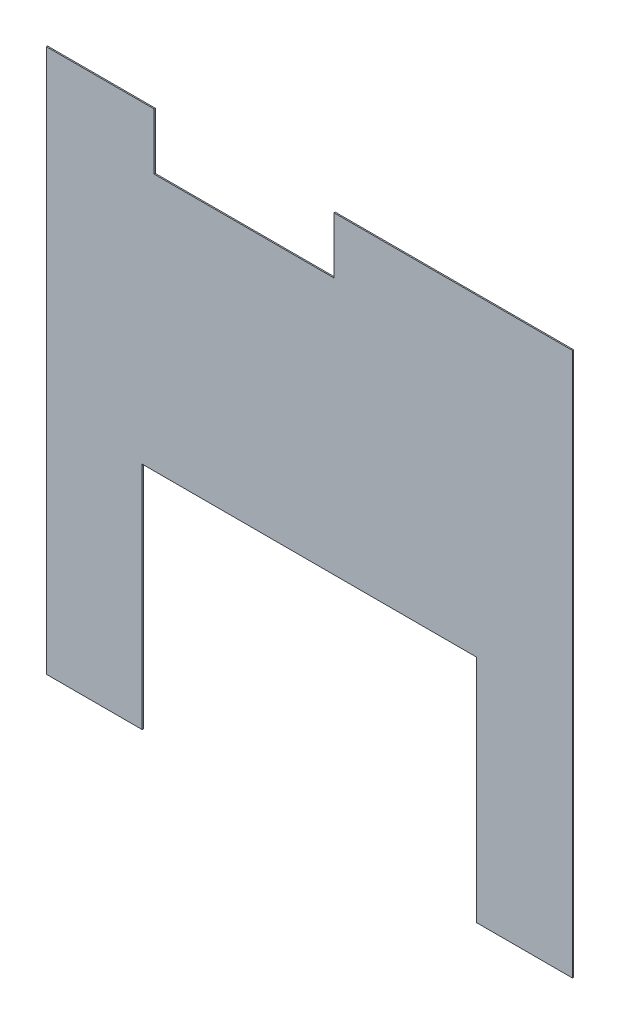
ISO-10303-21;
HEADER;
FILE_DESCRIPTION(('STEP AP214'),'2;1');
FILE_NAME('part.step','',(''),(''),'','','');
FILE_SCHEMA(('AUTOMOTIVE_DESIGN { 1 0 10303 214 1 1 1 1 }'));
ENDSEC;
DATA;
#1=APPLICATION_CONTEXT('core data for automotive mechanical design processes');
#2=APPLICATION_PROTOCOL_DEFINITION('international standard','automotive_design',2000,#1);
#3=PRODUCT_CONTEXT('',#1,'mechanical');
#4=PRODUCT('Part','Part','',(#3));
#5=PRODUCT_RELATED_PRODUCT_CATEGORY('part','',(#4));
#6=PRODUCT_DEFINITION_FORMATION('','',#4);
#7=PRODUCT_DEFINITION_CONTEXT('part definition',#1,'design');
#8=PRODUCT_DEFINITION('design','',#6,#7);
#9=PRODUCT_DEFINITION_SHAPE('','',#8);
#10=(LENGTH_UNIT() NAMED_UNIT(*) SI_UNIT(.MILLI.,.METRE.));
#11=(NAMED_UNIT(*) PLANE_ANGLE_UNIT() SI_UNIT($,.RADIAN.));
#12=(NAMED_UNIT(*) SI_UNIT($,.STERADIAN.) SOLID_ANGLE_UNIT());
#13=UNCERTAINTY_MEASURE_WITH_UNIT(LENGTH_MEASURE(1.E-05),#10,'distance_accuracy_value','');
#14=(GEOMETRIC_REPRESENTATION_CONTEXT(3) GLOBAL_UNCERTAINTY_ASSIGNED_CONTEXT((#13)) GLOBAL_UNIT_ASSIGNED_CONTEXT((#10,
#11,#12)) REPRESENTATION_CONTEXT('',''));
#15=CARTESIAN_POINT('',(0.,0.,0.));
#16=DIRECTION('',(0.,0.,1.));
#17=DIRECTION('',(1.,0.,0.));
#18=AXIS2_PLACEMENT_3D('',#15,#16,#17);
#19=CARTESIAN_POINT('',(0.,0.,2.9));
#20=DIRECTION('',(0.,-1.,0.));
#21=DIRECTION('',(0.,0.,-1.));
#22=AXIS2_PLACEMENT_3D('',#19,#20,#21);
#23=PLANE('',#22);
#24=DIRECTION('',(-1.,0.,0.));
#25=VECTOR('',#24,1.);
#26=CARTESIAN_POINT('',(0.,0.,2.9));
#27=LINE('',#26,#25);
#28=CARTESIAN_POINT('',(258.,0.,2.9));
#29=VERTEX_POINT('',#28);
#30=CARTESIAN_POINT('',(0.,0.,2.9));
#31=VERTEX_POINT('',#30);
#32=EDGE_CURVE('E186',#29,#31,#27,.T.);
#33=ORIENTED_EDGE('',*,*,#32,.F.);
#34=DIRECTION('',(0.,0.,1.));
#35=VECTOR('',#34,1.);
#36=CARTESIAN_POINT('',(258.,0.,-7.1));
#37=LINE('',#36,#35);
#38=CARTESIAN_POINT('',(258.,0.,0.));
#39=VERTEX_POINT('',#38);
#40=EDGE_CURVE('E137',#39,#29,#37,.T.);
#41=ORIENTED_EDGE('',*,*,#40,.F.);
#42=DIRECTION('',(-1.,0.,0.));
#43=VECTOR('',#42,1.);
#44=CARTESIAN_POINT('',(0.,0.,0.));
#45=LINE('',#44,#43);
#46=CARTESIAN_POINT('',(0.,0.,0.));
#47=VERTEX_POINT('',#46);
#48=EDGE_CURVE('E198',#39,#47,#45,.T.);
#49=ORIENTED_EDGE('',*,*,#48,.T.);
#50=DIRECTION('',(0.,0.,-1.));
#51=VECTOR('',#50,1.);
#52=CARTESIAN_POINT('',(0.,0.,2.9));
#53=LINE('',#52,#51);
#54=EDGE_CURVE('E189',#31,#47,#53,.T.);
#55=ORIENTED_EDGE('',*,*,#54,.F.);
#56=EDGE_LOOP('',(#33,#41,#49,#55));
#57=FACE_BOUND('',#56,.T.);
#58=ADVANCED_FACE('F35',(#57),#23,.F.);
#59=CARTESIAN_POINT('',(1.59204083889156E-13,-1300.,2.9));
#60=DIRECTION('',(0.,1.,0.));
#61=DIRECTION('',(0.,0.,1.));
#62=AXIS2_PLACEMENT_3D('',#59,#60,#61);
#63=PLANE('',#62);
#64=DIRECTION('',(1.,0.,0.));
#65=VECTOR('',#64,1.);
#66=CARTESIAN_POINT('',(1.59204083889156E-13,-1300.,0.));
#67=LINE('',#66,#65);
#68=CARTESIAN_POINT('',(1.59204083889156E-13,-1300.,0.));
#69=VERTEX_POINT('',#68);
#70=CARTESIAN_POINT('',(229.1,-1300.,0.));
#71=VERTEX_POINT('',#70);
#72=EDGE_CURVE('E193',#69,#71,#67,.T.);
#73=ORIENTED_EDGE('',*,*,#72,.T.);
#74=DIRECTION('',(0.,0.,1.));
#75=VECTOR('',#74,1.);
#76=CARTESIAN_POINT('',(229.1,-1300.,0.));
#77=LINE('',#76,#75);
#78=CARTESIAN_POINT('',(229.1,-1300.,2.9));
#79=VERTEX_POINT('',#78);
#80=EDGE_CURVE('E167',#71,#79,#77,.T.);
#81=ORIENTED_EDGE('',*,*,#80,.T.);
#82=DIRECTION('',(1.,0.,0.));
#83=VECTOR('',#82,1.);
#84=CARTESIAN_POINT('',(1.59204083889156E-13,-1300.,2.9));
#85=LINE('',#84,#83);
#86=CARTESIAN_POINT('',(1.59204083889156E-13,-1300.,2.9));
#87=VERTEX_POINT('',#86);
#88=EDGE_CURVE('E181',#87,#79,#85,.T.);
#89=ORIENTED_EDGE('',*,*,#88,.F.);
#90=DIRECTION('',(0.,0.,-1.));
#91=VECTOR('',#90,1.);
#92=CARTESIAN_POINT('',(1.59204083889156E-13,-1300.,2.9));
#93=LINE('',#92,#91);
#94=EDGE_CURVE('E209',#87,#69,#93,.T.);
#95=ORIENTED_EDGE('',*,*,#94,.T.);
#96=EDGE_LOOP('',(#73,#81,#89,#95));
#97=FACE_BOUND('',#96,.T.);
#98=ADVANCED_FACE('F243',(#97),#63,.F.);
#99=CARTESIAN_POINT('',(0.,0.,2.9));
#100=DIRECTION('',(1.,0.,0.));
#101=DIRECTION('',(0.,1.,0.));
#102=AXIS2_PLACEMENT_3D('',#99,#100,#101);
#103=PLANE('',#102);
#104=DIRECTION('',(0.,-1.,0.));
#105=VECTOR('',#104,1.);
#106=CARTESIAN_POINT('',(0.,0.,0.));
#107=LINE('',#106,#105);
#108=EDGE_CURVE('E170',#47,#69,#107,.T.);
#109=ORIENTED_EDGE('',*,*,#108,.T.);
#110=ORIENTED_EDGE('',*,*,#94,.F.);
#111=DIRECTION('',(0.,-1.,0.));
#112=VECTOR('',#111,1.);
#113=CARTESIAN_POINT('',(0.,0.,2.9));
#114=LINE('',#113,#112);
#115=EDGE_CURVE('E176',#31,#87,#114,.T.);
#116=ORIENTED_EDGE('',*,*,#115,.F.);
#117=ORIENTED_EDGE('',*,*,#54,.T.);
#118=EDGE_LOOP('',(#109,#110,#116,#117));
#119=FACE_BOUND('',#118,.T.);
#120=ADVANCED_FACE('F37',(#119),#103,.F.);
#121=CARTESIAN_POINT('',(1029.1,-1300.,2.9));
#122=VERTEX_POINT('',#121);
#123=CARTESIAN_POINT('',(1258.2,-1300.,2.9));
#124=VERTEX_POINT('',#123);
#125=EDGE_CURVE('E179',#122,#124,#85,.T.);
#126=ORIENTED_EDGE('',*,*,#125,.F.);
#127=DIRECTION('',(0.,0.,1.));
#128=VECTOR('',#127,1.);
#129=CARTESIAN_POINT('',(1029.1,-1300.,0.));
#130=LINE('',#129,#128);
#131=CARTESIAN_POINT('',(1029.1,-1300.,0.));
#132=VERTEX_POINT('',#131);
#133=EDGE_CURVE('E160',#132,#122,#130,.T.);
#134=ORIENTED_EDGE('',*,*,#133,.F.);
#135=CARTESIAN_POINT('',(1258.2,-1300.,0.));
#136=VERTEX_POINT('',#135);
#137=EDGE_CURVE('E192',#132,#136,#67,.T.);
#138=ORIENTED_EDGE('',*,*,#137,.T.);
#139=DIRECTION('',(0.,0.,-1.));
#140=VECTOR('',#139,1.);
#141=CARTESIAN_POINT('',(1258.2,-1300.,2.9));
#142=LINE('',#141,#140);
#143=EDGE_CURVE('E206',#124,#136,#142,.T.);
#144=ORIENTED_EDGE('',*,*,#143,.F.);
#145=EDGE_LOOP('',(#126,#134,#138,#144));
#146=FACE_BOUND('',#145,.T.);
#147=ADVANCED_FACE('F231',(#146),#63,.F.);
#148=CARTESIAN_POINT('',(1258.2,0.,2.9));
#149=DIRECTION('',(-1.,0.,0.));
#150=DIRECTION('',(0.,-1.,0.));
#151=AXIS2_PLACEMENT_3D('',#148,#149,#150);
#152=PLANE('',#151);
#153=DIRECTION('',(0.,1.,0.));
#154=VECTOR('',#153,1.);
#155=CARTESIAN_POINT('',(1258.2,0.,0.));
#156=LINE('',#155,#154);
#157=CARTESIAN_POINT('',(1258.2,0.,0.));
#158=VERTEX_POINT('',#157);
#159=EDGE_CURVE('E196',#136,#158,#156,.T.);
#160=ORIENTED_EDGE('',*,*,#159,.T.);
#161=DIRECTION('',(0.,0.,-1.));
#162=VECTOR('',#161,1.);
#163=CARTESIAN_POINT('',(1258.2,0.,2.9));
#164=LINE('',#163,#162);
#165=CARTESIAN_POINT('',(1258.2,0.,2.9));
#166=VERTEX_POINT('',#165);
#167=EDGE_CURVE('E203',#166,#158,#164,.T.);
#168=ORIENTED_EDGE('',*,*,#167,.F.);
#169=DIRECTION('',(0.,1.,0.));
#170=VECTOR('',#169,1.);
#171=CARTESIAN_POINT('',(1258.2,0.,2.9));
#172=LINE('',#171,#170);
#173=EDGE_CURVE('E184',#124,#166,#172,.T.);
#174=ORIENTED_EDGE('',*,*,#173,.F.);
#175=ORIENTED_EDGE('',*,*,#143,.T.);
#176=EDGE_LOOP('',(#160,#168,#174,#175));
#177=FACE_BOUND('',#176,.T.);
#178=ADVANCED_FACE('F225',(#177),#152,.F.);
#179=CARTESIAN_POINT('',(688.,0.,0.));
#180=VERTEX_POINT('',#179);
#181=EDGE_CURVE('E180',#158,#180,#45,.T.);
#182=ORIENTED_EDGE('',*,*,#181,.T.);
#183=DIRECTION('',(0.,0.,1.));
#184=VECTOR('',#183,1.);
#185=CARTESIAN_POINT('',(688.,0.,-7.1));
#186=LINE('',#185,#184);
#187=CARTESIAN_POINT('',(688.,0.,2.9));
#188=VERTEX_POINT('',#187);
#189=EDGE_CURVE('E148',#180,#188,#186,.T.);
#190=ORIENTED_EDGE('',*,*,#189,.T.);
#191=EDGE_CURVE('E187',#166,#188,#27,.T.);
#192=ORIENTED_EDGE('',*,*,#191,.F.);
#193=ORIENTED_EDGE('',*,*,#167,.T.);
#194=EDGE_LOOP('',(#182,#190,#192,#193));
#195=FACE_BOUND('',#194,.T.);
#196=ADVANCED_FACE('F220',(#195),#23,.F.);
#197=CARTESIAN_POINT('',(0.,0.,2.9));
#198=DIRECTION('',(0.,0.,1.));
#199=DIRECTION('',(1.,0.,0.));
#200=AXIS2_PLACEMENT_3D('',#197,#198,#199);
#201=PLANE('',#200);
#202=DIRECTION('',(0.,-1.,0.));
#203=VECTOR('',#202,1.);
#204=CARTESIAN_POINT('',(258.,0.,2.9));
#205=LINE('',#204,#203);
#206=CARTESIAN_POINT('',(258.,-134.999999999999,2.9));
#207=VERTEX_POINT('',#206);
#208=EDGE_CURVE('E134',#29,#207,#205,.T.);
#209=ORIENTED_EDGE('',*,*,#208,.F.);
#210=ORIENTED_EDGE('',*,*,#32,.T.);
#211=ORIENTED_EDGE('',*,*,#115,.T.);
#212=ORIENTED_EDGE('',*,*,#88,.T.);
#213=DIRECTION('',(0.,-1.,0.));
#214=VECTOR('',#213,1.);
#215=CARTESIAN_POINT('',(229.1,-1300.,2.9));
#216=LINE('',#215,#214);
#217=CARTESIAN_POINT('',(229.1,-750.,2.9));
#218=VERTEX_POINT('',#217);
#219=EDGE_CURVE('E155',#218,#79,#216,.T.);
#220=ORIENTED_EDGE('',*,*,#219,.F.);
#221=DIRECTION('',(-1.,0.,0.));
#222=VECTOR('',#221,1.);
#223=CARTESIAN_POINT('',(229.1,-750.,2.9));
#224=LINE('',#223,#222);
#225=CARTESIAN_POINT('',(1029.1,-750.,2.9));
#226=VERTEX_POINT('',#225);
#227=EDGE_CURVE('E163',#226,#218,#224,.T.);
#228=ORIENTED_EDGE('',*,*,#227,.F.);
#229=DIRECTION('',(0.,1.,0.));
#230=VECTOR('',#229,1.);
#231=CARTESIAN_POINT('',(1029.1,-1300.,2.9));
#232=LINE('',#231,#230);
#233=EDGE_CURVE('E147',#122,#226,#232,.T.);
#234=ORIENTED_EDGE('',*,*,#233,.F.);
#235=ORIENTED_EDGE('',*,*,#125,.T.);
#236=ORIENTED_EDGE('',*,*,#173,.T.);
#237=ORIENTED_EDGE('',*,*,#191,.T.);
#238=DIRECTION('',(0.,1.,0.));
#239=VECTOR('',#238,1.);
#240=CARTESIAN_POINT('',(688.,0.,2.9));
#241=LINE('',#240,#239);
#242=CARTESIAN_POINT('',(688.,-135.,2.9));
#243=VERTEX_POINT('',#242);
#244=EDGE_CURVE('E131',#243,#188,#241,.T.);
#245=ORIENTED_EDGE('',*,*,#244,.F.);
#246=DIRECTION('',(1.,0.,0.));
#247=VECTOR('',#246,1.);
#248=CARTESIAN_POINT('',(258.,-134.999999999999,2.9));
#249=LINE('',#248,#247);
#250=EDGE_CURVE('E126',#207,#243,#249,.T.);
#251=ORIENTED_EDGE('',*,*,#250,.F.);
#252=EDGE_LOOP('',(#209,#210,#211,#212,#220,#228,#234,#235,#236,#237,#245,#251));
#253=FACE_BOUND('',#252,.T.);
#254=ADVANCED_FACE('F141',(#253),#201,.T.);
#255=CARTESIAN_POINT('',(0.,0.,0.));
#256=DIRECTION('',(0.,0.,1.));
#257=DIRECTION('',(1.,0.,0.));
#258=AXIS2_PLACEMENT_3D('',#255,#256,#257);
#259=PLANE('',#258);
#260=ORIENTED_EDGE('',*,*,#48,.F.);
#261=DIRECTION('',(0.,-1.,0.));
#262=VECTOR('',#261,1.);
#263=CARTESIAN_POINT('',(258.,2.12175955817253E-13,0.));
#264=LINE('',#263,#262);
#265=CARTESIAN_POINT('',(258.,-134.999999999999,0.));
#266=VERTEX_POINT('',#265);
#267=EDGE_CURVE('E11',#39,#266,#264,.T.);
#268=ORIENTED_EDGE('',*,*,#267,.T.);
#269=DIRECTION('',(1.,0.,0.));
#270=VECTOR('',#269,1.);
#271=CARTESIAN_POINT('',(0.,-134.999999999999,0.));
#272=LINE('',#271,#270);
#273=CARTESIAN_POINT('',(688.,-135.,0.));
#274=VERTEX_POINT('',#273);
#275=EDGE_CURVE('E129',#266,#274,#272,.T.);
#276=ORIENTED_EDGE('',*,*,#275,.T.);
#277=DIRECTION('',(0.,1.,0.));
#278=VECTOR('',#277,1.);
#279=CARTESIAN_POINT('',(688.,5.65802548846007E-13,0.));
#280=LINE('',#279,#278);
#281=EDGE_CURVE('E43',#274,#180,#280,.T.);
#282=ORIENTED_EDGE('',*,*,#281,.T.);
#283=ORIENTED_EDGE('',*,*,#181,.F.);
#284=ORIENTED_EDGE('',*,*,#159,.F.);
#285=ORIENTED_EDGE('',*,*,#137,.F.);
#286=DIRECTION('',(0.,1.,0.));
#287=VECTOR('',#286,1.);
#288=CARTESIAN_POINT('',(1029.1,-1300.,0.));
#289=LINE('',#288,#287);
#290=CARTESIAN_POINT('',(1029.1,-750.,0.));
#291=VERTEX_POINT('',#290);
#292=EDGE_CURVE('E152',#132,#291,#289,.T.);
#293=ORIENTED_EDGE('',*,*,#292,.T.);
#294=DIRECTION('',(-1.,0.,0.));
#295=VECTOR('',#294,1.);
#296=CARTESIAN_POINT('',(229.1,-750.,0.));
#297=LINE('',#296,#295);
#298=CARTESIAN_POINT('',(229.1,-750.,0.));
#299=VERTEX_POINT('',#298);
#300=EDGE_CURVE('E58',#291,#299,#297,.T.);
#301=ORIENTED_EDGE('',*,*,#300,.T.);
#302=DIRECTION('',(0.,-1.,0.));
#303=VECTOR('',#302,1.);
#304=CARTESIAN_POINT('',(229.1,-1300.,0.));
#305=LINE('',#304,#303);
#306=EDGE_CURVE('E157',#299,#71,#305,.T.);
#307=ORIENTED_EDGE('',*,*,#306,.T.);
#308=ORIENTED_EDGE('',*,*,#72,.F.);
#309=ORIENTED_EDGE('',*,*,#108,.F.);
#310=EDGE_LOOP('',(#260,#268,#276,#282,#283,#284,#285,#293,#301,#307,#308,#309));
#311=FACE_BOUND('',#310,.T.);
#312=ADVANCED_FACE('F216',(#311),#259,.F.);
#313=CARTESIAN_POINT('',(229.1,-1300.,0.));
#314=DIRECTION('',(-1.,0.,0.));
#315=DIRECTION('',(0.,0.,1.));
#316=AXIS2_PLACEMENT_3D('',#313,#314,#315);
#317=PLANE('',#316);
#318=ORIENTED_EDGE('',*,*,#219,.T.);
#319=ORIENTED_EDGE('',*,*,#80,.F.);
#320=ORIENTED_EDGE('',*,*,#306,.F.);
#321=DIRECTION('',(0.,0.,1.));
#322=VECTOR('',#321,1.);
#323=CARTESIAN_POINT('',(229.1,-750.,0.));
#324=LINE('',#323,#322);
#325=EDGE_CURVE('E171',#299,#218,#324,.T.);
#326=ORIENTED_EDGE('',*,*,#325,.T.);
#327=EDGE_LOOP('',(#318,#319,#320,#326));
#328=FACE_BOUND('',#327,.T.);
#329=ADVANCED_FACE('F240',(#328),#317,.F.);
#330=CARTESIAN_POINT('',(229.1,-750.,0.));
#331=DIRECTION('',(0.,1.,0.));
#332=DIRECTION('',(0.,0.,1.));
#333=AXIS2_PLACEMENT_3D('',#330,#331,#332);
#334=PLANE('',#333);
#335=ORIENTED_EDGE('',*,*,#227,.T.);
#336=ORIENTED_EDGE('',*,*,#325,.F.);
#337=ORIENTED_EDGE('',*,*,#300,.F.);
#338=DIRECTION('',(0.,0.,1.));
#339=VECTOR('',#338,1.);
#340=CARTESIAN_POINT('',(1029.1,-750.,0.));
#341=LINE('',#340,#339);
#342=EDGE_CURVE('E173',#291,#226,#341,.T.);
#343=ORIENTED_EDGE('',*,*,#342,.T.);
#344=EDGE_LOOP('',(#335,#336,#337,#343));
#345=FACE_BOUND('',#344,.T.);
#346=ADVANCED_FACE('F237',(#345),#334,.F.);
#347=CARTESIAN_POINT('',(1029.1,-1300.,0.));
#348=DIRECTION('',(1.,0.,0.));
#349=DIRECTION('',(0.,0.,-1.));
#350=AXIS2_PLACEMENT_3D('',#347,#348,#349);
#351=PLANE('',#350);
#352=ORIENTED_EDGE('',*,*,#233,.T.);
#353=ORIENTED_EDGE('',*,*,#342,.F.);
#354=ORIENTED_EDGE('',*,*,#292,.F.);
#355=ORIENTED_EDGE('',*,*,#133,.T.);
#356=EDGE_LOOP('',(#352,#353,#354,#355));
#357=FACE_BOUND('',#356,.T.);
#358=ADVANCED_FACE('F234',(#357),#351,.F.);
#359=CARTESIAN_POINT('',(258.,0.,-7.1));
#360=DIRECTION('',(-1.,0.,0.));
#361=DIRECTION('',(0.,-1.,0.));
#362=AXIS2_PLACEMENT_3D('',#359,#360,#361);
#363=PLANE('',#362);
#364=ORIENTED_EDGE('',*,*,#40,.T.);
#365=ORIENTED_EDGE('',*,*,#208,.T.);
#366=DIRECTION('',(0.,0.,1.));
#367=VECTOR('',#366,1.);
#368=CARTESIAN_POINT('',(258.,-134.999999999999,-7.1));
#369=LINE('',#368,#367);
#370=EDGE_CURVE('E122',#266,#207,#369,.T.);
#371=ORIENTED_EDGE('',*,*,#370,.F.);
#372=ORIENTED_EDGE('',*,*,#267,.F.);
#373=EDGE_LOOP('',(#364,#365,#371,#372));
#374=FACE_BOUND('',#373,.T.);
#375=ADVANCED_FACE('F135',(#374),#363,.F.);
#376=CARTESIAN_POINT('',(688.,0.,-7.1));
#377=DIRECTION('',(1.,0.,0.));
#378=DIRECTION('',(0.,1.,0.));
#379=AXIS2_PLACEMENT_3D('',#376,#377,#378);
#380=PLANE('',#379);
#381=DIRECTION('',(0.,0.,1.));
#382=VECTOR('',#381,1.);
#383=CARTESIAN_POINT('',(688.,-135.,-7.1));
#384=LINE('',#383,#382);
#385=EDGE_CURVE('E50',#274,#243,#384,.T.);
#386=ORIENTED_EDGE('',*,*,#385,.T.);
#387=ORIENTED_EDGE('',*,*,#244,.T.);
#388=ORIENTED_EDGE('',*,*,#189,.F.);
#389=ORIENTED_EDGE('',*,*,#281,.F.);
#390=EDGE_LOOP('',(#386,#387,#388,#389));
#391=FACE_BOUND('',#390,.T.);
#392=ADVANCED_FACE('F334',(#391),#380,.F.);
#393=CARTESIAN_POINT('',(258.,-134.999999999999,-7.1));
#394=DIRECTION('',(0.,-1.,0.));
#395=DIRECTION('',(1.,0.,0.));
#396=AXIS2_PLACEMENT_3D('',#393,#394,#395);
#397=PLANE('',#396);
#398=ORIENTED_EDGE('',*,*,#370,.T.);
#399=ORIENTED_EDGE('',*,*,#250,.T.);
#400=ORIENTED_EDGE('',*,*,#385,.F.);
#401=ORIENTED_EDGE('',*,*,#275,.F.);
#402=EDGE_LOOP('',(#398,#399,#400,#401));
#403=FACE_BOUND('',#402,.T.);
#404=ADVANCED_FACE('F124',(#403),#397,.F.);
#405=CLOSED_SHELL('',(#58,#98,#120,#147,#178,#196,#254,#312,#329,#346,#358,#375,#392,#404));
#406=MANIFOLD_SOLID_BREP('B2',#405);
#407=ADVANCED_BREP_SHAPE_REPRESENTATION('',(#18,#406),#14);
#408=SHAPE_DEFINITION_REPRESENTATION(#9,#407);
ENDSEC;
END-ISO-10303-21;
